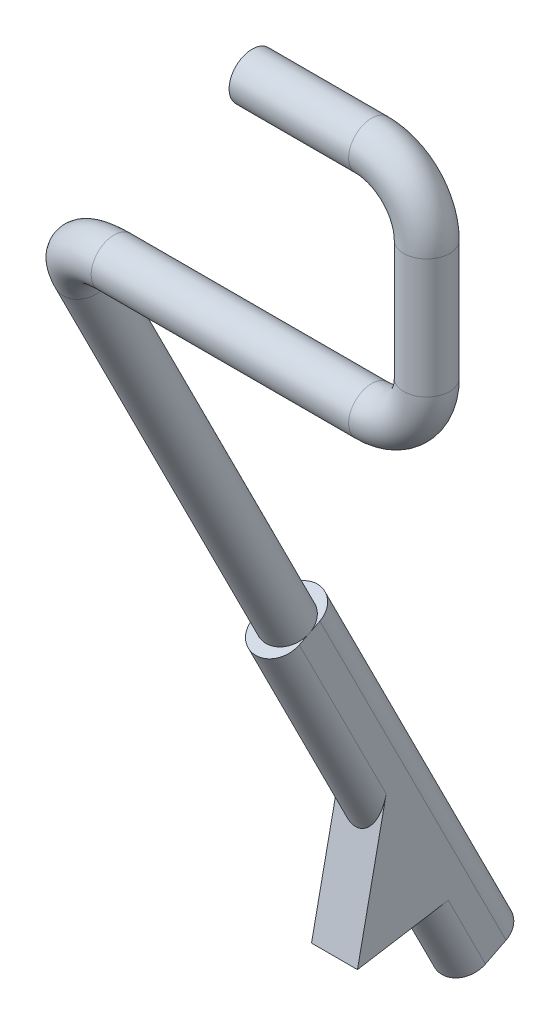
ISO-10303-21;
HEADER;
FILE_DESCRIPTION(('STEP AP214'),'2;1');
FILE_NAME('part.step','',(''),(''),'','','');
FILE_SCHEMA(('AUTOMOTIVE_DESIGN { 1 0 10303 214 1 1 1 1 }'));
ENDSEC;
DATA;
#1=APPLICATION_CONTEXT('core data for automotive mechanical design processes');
#2=APPLICATION_PROTOCOL_DEFINITION('international standard','automotive_design',2000,#1);
#3=PRODUCT_CONTEXT('',#1,'mechanical');
#4=PRODUCT('Part','Part','',(#3));
#5=PRODUCT_RELATED_PRODUCT_CATEGORY('part','',(#4));
#6=PRODUCT_DEFINITION_FORMATION('','',#4);
#7=PRODUCT_DEFINITION_CONTEXT('part definition',#1,'design');
#8=PRODUCT_DEFINITION('design','',#6,#7);
#9=PRODUCT_DEFINITION_SHAPE('','',#8);
#10=(LENGTH_UNIT() NAMED_UNIT(*) SI_UNIT(.MILLI.,.METRE.));
#11=(NAMED_UNIT(*) PLANE_ANGLE_UNIT() SI_UNIT($,.RADIAN.));
#12=(NAMED_UNIT(*) SI_UNIT($,.STERADIAN.) SOLID_ANGLE_UNIT());
#13=UNCERTAINTY_MEASURE_WITH_UNIT(LENGTH_MEASURE(1.E-05),#10,'distance_accuracy_value','');
#14=(GEOMETRIC_REPRESENTATION_CONTEXT(3) GLOBAL_UNCERTAINTY_ASSIGNED_CONTEXT((#13)) GLOBAL_UNIT_ASSIGNED_CONTEXT((#10,
#11,#12)) REPRESENTATION_CONTEXT('',''));
#15=CARTESIAN_POINT('',(0.,0.,0.));
#16=DIRECTION('',(0.,0.,1.));
#17=DIRECTION('',(1.,0.,0.));
#18=AXIS2_PLACEMENT_3D('',#15,#16,#17);
#19=CARTESIAN_POINT('',(-40.,-74.6790705236024,-23.6337143062818));
#20=DIRECTION('',(0.,-0.893028554974588,-0.45));
#21=DIRECTION('',(0.,0.45,-0.893028554974588));
#22=AXIS2_PLACEMENT_3D('',#19,#20,#21);
#23=CYLINDRICAL_SURFACE('',#22,2.5);
#24=CARTESIAN_POINT('',(-40.,-93.4326701780686,-33.0837143062817));
#25=DIRECTION('',(0.,0.203668249795082,0.979039960382317));
#26=DIRECTION('',(0.,-0.979039960382317,0.203668249795082));
#27=AXIS2_PLACEMENT_3D('',#24,#25,#26);
#28=ELLIPSE('',#27,4.01638979441671,2.5);
#29=CARTESIAN_POINT('',(-37.5,-93.4326701780687,-33.0837143062817));
#30=VERTEX_POINT('',#29);
#31=CARTESIAN_POINT('',(-42.5000000000001,-93.4326701780687,-33.0837143062817));
#32=VERTEX_POINT('',#31);
#33=EDGE_CURVE('E11',#30,#32,#28,.F.);
#34=ORIENTED_EDGE('',*,*,#33,.F.);
#35=DIRECTION('',(0.,-0.893028554974588,-0.45));
#36=VECTOR('',#35,1.);
#37=CARTESIAN_POINT('',(-37.5,-74.6790705236024,-23.6337143062818));
#38=LINE('',#37,#36);
#39=CARTESIAN_POINT('',(-37.5,-74.6790705236024,-23.6337143062818));
#40=VERTEX_POINT('',#39);
#41=EDGE_CURVE('E143',#40,#30,#38,.T.);
#42=ORIENTED_EDGE('',*,*,#41,.F.);
#43=CARTESIAN_POINT('',(-40.,-74.6790705236024,-23.6337143062818));
#44=DIRECTION('',(0.,-0.893028554974587,-0.450000000000001));
#45=DIRECTION('',(0.,0.450000000000001,-0.893028554974587));
#46=AXIS2_PLACEMENT_3D('',#43,#44,#45);
#47=CIRCLE('',#46,2.5);
#48=CARTESIAN_POINT('',(-42.5,-74.6790705236024,-23.6337143062818));
#49=VERTEX_POINT('',#48);
#50=EDGE_CURVE('E207',#40,#49,#47,.T.);
#51=ORIENTED_EDGE('',*,*,#50,.T.);
#52=DIRECTION('',(0.,-0.893028554974588,-0.45));
#53=VECTOR('',#52,1.);
#54=CARTESIAN_POINT('',(-42.5,-74.6790705236024,-23.6337143062818));
#55=LINE('',#54,#53);
#56=EDGE_CURVE('E142',#49,#32,#55,.T.);
#57=ORIENTED_EDGE('',*,*,#56,.T.);
#58=EDGE_LOOP('',(#34,#42,#51,#57));
#59=FACE_BOUND('',#58,.T.);
#60=ADVANCED_FACE('F51',(#59),#23,.T.);
#61=CARTESIAN_POINT('',(-40.,-114.302855497459,-45.));
#62=DIRECTION('',(0.,0.893028554974588,0.45));
#63=DIRECTION('',(0.,-0.45,0.893028554974588));
#64=AXIS2_PLACEMENT_3D('',#61,#62,#63);
#65=CYLINDRICAL_SURFACE('',#64,2.5);
#66=CARTESIAN_POINT('',(-40.,-30.3581713298475,-2.70000000000001));
#67=DIRECTION('',(0.,-0.893028554974588,-0.45));
#68=DIRECTION('',(0.450000000000002,0.401862849738564,-0.7975));
#69=AXIS2_PLACEMENT_3D('',#66,#67,#68);
#70=CIRCLE('',#69,2.5);
#71=CARTESIAN_POINT('',(-42.5,-30.3581713298475,-2.70000000000001));
#72=VERTEX_POINT('',#71);
#73=EDGE_CURVE('E155',#72,#72,#70,.T.);
#74=ORIENTED_EDGE('',*,*,#73,.T.);
#75=EDGE_LOOP('',(#74));
#76=FACE_BOUND('',#75,.T.);
#77=CARTESIAN_POINT('',(-40.,-74.1165705236024,-24.75));
#78=DIRECTION('',(0.,-0.893028554974587,-0.450000000000001));
#79=DIRECTION('',(0.,0.450000000000001,-0.893028554974587));
#80=AXIS2_PLACEMENT_3D('',#77,#78,#79);
#81=CIRCLE('',#80,2.5);
#82=CARTESIAN_POINT('',(-37.5,-74.1165705236024,-24.75));
#83=VERTEX_POINT('',#82);
#84=CARTESIAN_POINT('',(-42.5,-74.1165705236024,-24.75));
#85=VERTEX_POINT('',#84);
#86=EDGE_CURVE('E135',#83,#85,#81,.T.);
#87=ORIENTED_EDGE('',*,*,#86,.F.);
#88=EDGE_CURVE('E74',#85,#83,#81,.T.);
#89=ORIENTED_EDGE('',*,*,#88,.F.);
#90=EDGE_LOOP('',(#87,#89));
#91=FACE_BOUND('',#90,.T.);
#92=ADVANCED_FACE('F266',(#76,#91),#65,.T.);
#93=CARTESIAN_POINT('',(-19.,0.,0.));
#94=DIRECTION('',(1.,0.,0.));
#95=DIRECTION('',(0.,0.,-1.));
#96=AXIS2_PLACEMENT_3D('',#93,#94,#95);
#97=PLANE('',#96);
#98=CARTESIAN_POINT('',(-19.,0.,0.));
#99=DIRECTION('',(1.,0.,0.));
#100=DIRECTION('',(0.,0.,-1.));
#101=AXIS2_PLACEMENT_3D('',#98,#99,#100);
#102=CIRCLE('',#101,2.5);
#103=CARTESIAN_POINT('',(-19.,0.,-2.5));
#104=VERTEX_POINT('',#103);
#105=EDGE_CURVE('E180',#104,#104,#102,.T.);
#106=ORIENTED_EDGE('',*,*,#105,.F.);
#107=EDGE_LOOP('',(#106));
#108=FACE_BOUND('',#107,.T.);
#109=ADVANCED_FACE('F272',(#108),#97,.F.);
#110=CARTESIAN_POINT('',(-34.,-30.3581713298475,-2.70000000000001));
#111=DIRECTION('',(0.,0.450000000000002,-0.893028554974587));
#112=DIRECTION('',(0.,0.893028554974587,0.450000000000002));
#113=AXIS2_PLACEMENT_3D('',#110,#111,#112);
#114=TOROIDAL_SURFACE('',#113,6.00000000000001,2.5);
#115=CARTESIAN_POINT('',(-34.,-25.,0.));
#116=DIRECTION('',(-1.,0.,0.));
#117=DIRECTION('',(0.,0.,-1.));
#118=AXIS2_PLACEMENT_3D('',#115,#116,#117);
#119=CIRCLE('',#118,2.5);
#120=CARTESIAN_POINT('',(-34.,-22.7674286125635,1.12500000000001));
#121=VERTEX_POINT('',#120);
#122=EDGE_CURVE('E159',#121,#121,#119,.T.);
#123=CARTESIAN_POINT('',(-34.,-30.3581713298475,-2.70000000000001));
#124=DIRECTION('',(0.,0.450000000000002,-0.893028554974587));
#125=DIRECTION('',(0.,0.893028554974587,0.450000000000002));
#126=AXIS2_PLACEMENT_3D('',#123,#124,#125);
#127=CIRCLE('',#126,8.50000000000001);
#128=EDGE_CURVE('',#72,#121,#127,.T.);
#129=ORIENTED_EDGE('',*,*,#73,.F.);
#130=ORIENTED_EDGE('',*,*,#122,.T.);
#131=ORIENTED_EDGE('',*,*,#128,.T.);
#132=ORIENTED_EDGE('',*,*,#128,.F.);
#133=EDGE_LOOP('',(#129,#131,#130,#132));
#134=FACE_BOUND('',#133,.T.);
#135=ADVANCED_FACE('F299',(#134),#114,.T.);
#136=CARTESIAN_POINT('',(-34.,-25.,0.));
#137=DIRECTION('',(1.,0.,0.));
#138=DIRECTION('',(0.,1.,0.));
#139=AXIS2_PLACEMENT_3D('',#136,#137,#138);
#140=CYLINDRICAL_SURFACE('',#139,2.5);
#141=CARTESIAN_POINT('',(-6.,-25.,0.));
#142=DIRECTION('',(-1.,0.,0.));
#143=DIRECTION('',(0.,0.,-1.));
#144=AXIS2_PLACEMENT_3D('',#141,#142,#143);
#145=CIRCLE('',#144,2.5);
#146=CARTESIAN_POINT('',(-6.,-27.5,0.));
#147=VERTEX_POINT('',#146);
#148=EDGE_CURVE('E164',#147,#147,#145,.T.);
#149=ORIENTED_EDGE('',*,*,#148,.T.);
#150=EDGE_LOOP('',(#149));
#151=FACE_BOUND('',#150,.T.);
#152=ORIENTED_EDGE('',*,*,#122,.F.);
#153=EDGE_LOOP('',(#152));
#154=FACE_BOUND('',#153,.T.);
#155=ADVANCED_FACE('F304',(#151,#154),#140,.T.);
#156=CARTESIAN_POINT('',(-6.,-19.,0.));
#157=DIRECTION('',(0.,0.,1.));
#158=DIRECTION('',(1.,0.,0.));
#159=AXIS2_PLACEMENT_3D('',#156,#157,#158);
#160=TOROIDAL_SURFACE('',#159,6.,2.5);
#161=CARTESIAN_POINT('',(0.,-19.,0.));
#162=DIRECTION('',(0.,-1.,0.));
#163=DIRECTION('',(0.,0.,-1.));
#164=AXIS2_PLACEMENT_3D('',#161,#162,#163);
#165=CIRCLE('',#164,2.5);
#166=CARTESIAN_POINT('',(2.5,-19.,0.));
#167=VERTEX_POINT('',#166);
#168=EDGE_CURVE('E168',#167,#167,#165,.T.);
#169=CARTESIAN_POINT('',(-6.,-19.,0.));
#170=DIRECTION('',(0.,0.,1.));
#171=DIRECTION('',(1.,0.,0.));
#172=AXIS2_PLACEMENT_3D('',#169,#170,#171);
#173=CIRCLE('',#172,8.5);
#174=EDGE_CURVE('',#147,#167,#173,.T.);
#175=ORIENTED_EDGE('',*,*,#148,.F.);
#176=ORIENTED_EDGE('',*,*,#168,.T.);
#177=ORIENTED_EDGE('',*,*,#174,.T.);
#178=ORIENTED_EDGE('',*,*,#174,.F.);
#179=EDGE_LOOP('',(#175,#177,#176,#178));
#180=FACE_BOUND('',#179,.T.);
#181=ADVANCED_FACE('F315',(#180),#160,.T.);
#182=CARTESIAN_POINT('',(0.,-19.,0.));
#183=DIRECTION('',(0.,1.,0.));
#184=DIRECTION('',(-1.,0.,0.));
#185=AXIS2_PLACEMENT_3D('',#182,#183,#184);
#186=CYLINDRICAL_SURFACE('',#185,2.5);
#187=CARTESIAN_POINT('',(0.,-6.00000000000004,0.));
#188=DIRECTION('',(0.,-1.,0.));
#189=DIRECTION('',(0.,0.,-1.));
#190=AXIS2_PLACEMENT_3D('',#187,#188,#189);
#191=CIRCLE('',#190,2.5);
#192=CARTESIAN_POINT('',(2.5,-6.00000000000006,0.));
#193=VERTEX_POINT('',#192);
#194=EDGE_CURVE('E172',#193,#193,#191,.T.);
#195=ORIENTED_EDGE('',*,*,#194,.T.);
#196=EDGE_LOOP('',(#195));
#197=FACE_BOUND('',#196,.T.);
#198=ORIENTED_EDGE('',*,*,#168,.F.);
#199=EDGE_LOOP('',(#198));
#200=FACE_BOUND('',#199,.T.);
#201=ADVANCED_FACE('F311',(#197,#200),#186,.T.);
#202=CARTESIAN_POINT('',(-6.,-6.,0.));
#203=DIRECTION('',(0.,0.,1.));
#204=DIRECTION('',(1.,0.,0.));
#205=AXIS2_PLACEMENT_3D('',#202,#203,#204);
#206=TOROIDAL_SURFACE('',#205,6.,2.5);
#207=CARTESIAN_POINT('',(-6.00000000000004,1.30971622436249E-13,0.));
#208=DIRECTION('',(1.,0.,0.));
#209=DIRECTION('',(0.,0.,-1.));
#210=AXIS2_PLACEMENT_3D('',#207,#208,#209);
#211=CIRCLE('',#210,2.5);
#212=CARTESIAN_POINT('',(-6.00000000000006,2.5,0.));
#213=VERTEX_POINT('',#212);
#214=EDGE_CURVE('E176',#213,#213,#211,.T.);
#215=CARTESIAN_POINT('',(-6.,-6.,0.));
#216=DIRECTION('',(0.,0.,1.));
#217=DIRECTION('',(1.,0.,0.));
#218=AXIS2_PLACEMENT_3D('',#215,#216,#217);
#219=CIRCLE('',#218,8.5);
#220=EDGE_CURVE('',#193,#213,#219,.T.);
#221=ORIENTED_EDGE('',*,*,#194,.F.);
#222=ORIENTED_EDGE('',*,*,#214,.T.);
#223=ORIENTED_EDGE('',*,*,#220,.T.);
#224=ORIENTED_EDGE('',*,*,#220,.F.);
#225=EDGE_LOOP('',(#221,#223,#222,#224));
#226=FACE_BOUND('',#225,.T.);
#227=ADVANCED_FACE('F295',(#226),#206,.T.);
#228=CARTESIAN_POINT('',(-6.00000000000004,0.,0.));
#229=DIRECTION('',(-1.,0.,0.));
#230=DIRECTION('',(0.,-1.,0.));
#231=AXIS2_PLACEMENT_3D('',#228,#229,#230);
#232=CYLINDRICAL_SURFACE('',#231,2.5);
#233=ORIENTED_EDGE('',*,*,#105,.T.);
#234=EDGE_LOOP('',(#233));
#235=FACE_BOUND('',#234,.T.);
#236=ORIENTED_EDGE('',*,*,#214,.F.);
#237=EDGE_LOOP('',(#236));
#238=FACE_BOUND('',#237,.T.);
#239=ADVANCED_FACE('F275',(#235,#238),#232,.T.);
#240=CARTESIAN_POINT('',(-37.5,-69.0540705236023,-34.7965712434642));
#241=DIRECTION('',(-1.,0.,0.));
#242=DIRECTION('',(0.,-1.,0.));
#243=AXIS2_PLACEMENT_3D('',#240,#241,#242);
#244=PLANE('',#243);
#245=DIRECTION('',(0.,0.450000000000001,-0.893028554974587));
#246=VECTOR('',#245,1.);
#247=CARTESIAN_POINT('',(-37.5,-109.240355497459,-55.0465712434642));
#248=LINE('',#247,#246);
#249=CARTESIAN_POINT('',(-37.5,-114.865355497459,-43.8837143062818));
#250=VERTEX_POINT('',#249);
#251=CARTESIAN_POINT('',(-37.5,-113.740355497459,-46.1162856937183));
#252=VERTEX_POINT('',#251);
#253=EDGE_CURVE('E216',#250,#252,#248,.T.);
#254=ORIENTED_EDGE('',*,*,#253,.T.);
#255=DIRECTION('',(0.,-0.893028554974588,-0.45));
#256=VECTOR('',#255,1.);
#257=CARTESIAN_POINT('',(-37.5,-73.5540705236024,-25.8662856937183));
#258=LINE('',#257,#256);
#259=CARTESIAN_POINT('',(-37.5,-73.5540705236024,-25.8662856937183));
#260=VERTEX_POINT('',#259);
#261=EDGE_CURVE('E160',#260,#252,#258,.T.);
#262=ORIENTED_EDGE('',*,*,#261,.F.);
#263=DIRECTION('',(0.,0.450000000000001,-0.893028554974587));
#264=VECTOR('',#263,1.);
#265=CARTESIAN_POINT('',(-37.5,-69.0540705236023,-34.7965712434642));
#266=LINE('',#265,#264);
#267=EDGE_CURVE('E227',#83,#260,#266,.T.);
#268=ORIENTED_EDGE('',*,*,#267,.F.);
#269=EDGE_CURVE('E199',#40,#83,#266,.T.);
#270=ORIENTED_EDGE('',*,*,#269,.F.);
#271=ORIENTED_EDGE('',*,*,#41,.T.);
#272=DIRECTION('',(0.,-0.979039960382317,0.203668249795082));
#273=VECTOR('',#272,1.);
#274=CARTESIAN_POINT('',(-37.5,-108.432670178069,-29.9632862639644));
#275=LINE('',#274,#273);
#276=CARTESIAN_POINT('',(-37.5,-108.432670178069,-29.9632862639644));
#277=VERTEX_POINT('',#276);
#278=EDGE_CURVE('E250',#30,#277,#275,.T.);
#279=ORIENTED_EDGE('',*,*,#278,.T.);
#280=DIRECTION('',(0.,0.160457167538118,-0.987042804231734));
#281=VECTOR('',#280,1.);
#282=CARTESIAN_POINT('',(-37.5,-106.828098502688,-39.8337143062817));
#283=LINE('',#282,#281);
#284=CARTESIAN_POINT('',(-37.5,-106.828098502687,-39.8337143062818));
#285=VERTEX_POINT('',#284);
#286=EDGE_CURVE('E67',#277,#285,#283,.T.);
#287=ORIENTED_EDGE('',*,*,#286,.T.);
#288=EDGE_CURVE('E133',#285,#250,#38,.T.);
#289=ORIENTED_EDGE('',*,*,#288,.T.);
#290=EDGE_LOOP('',(#254,#262,#268,#270,#271,#279,#287,#289));
#291=FACE_BOUND('',#290,.T.);
#292=ADVANCED_FACE('F239',(#291),#244,.F.);
#293=CARTESIAN_POINT('',(-42.5,-69.0540705236024,-34.7965712434641));
#294=DIRECTION('',(-1.,0.,0.));
#295=DIRECTION('',(0.,0.,1.));
#296=AXIS2_PLACEMENT_3D('',#293,#294,#295);
#297=PLANE('',#296);
#298=DIRECTION('',(0.,0.450000000000001,-0.893028554974587));
#299=VECTOR('',#298,1.);
#300=CARTESIAN_POINT('',(-42.5,-69.0540705236024,-34.7965712434641));
#301=LINE('',#300,#299);
#302=EDGE_CURVE('E196',#49,#85,#301,.T.);
#303=ORIENTED_EDGE('',*,*,#302,.T.);
#304=CARTESIAN_POINT('',(-42.5,-73.5540705236024,-25.8662856937183));
#305=VERTEX_POINT('',#304);
#306=EDGE_CURVE('E201',#85,#305,#301,.T.);
#307=ORIENTED_EDGE('',*,*,#306,.T.);
#308=DIRECTION('',(0.,-0.893028554974588,-0.45));
#309=VECTOR('',#308,1.);
#310=CARTESIAN_POINT('',(-42.5,-73.5540705236024,-25.8662856937183));
#311=LINE('',#310,#309);
#312=CARTESIAN_POINT('',(-42.5,-113.740355497459,-46.1162856937183));
#313=VERTEX_POINT('',#312);
#314=EDGE_CURVE('E149',#305,#313,#311,.T.);
#315=ORIENTED_EDGE('',*,*,#314,.T.);
#316=DIRECTION('',(0.,0.450000000000001,-0.893028554974587));
#317=VECTOR('',#316,1.);
#318=CARTESIAN_POINT('',(-42.5,-109.240355497459,-55.0465712434641));
#319=LINE('',#318,#317);
#320=CARTESIAN_POINT('',(-42.5,-114.865355497459,-43.8837143062818));
#321=VERTEX_POINT('',#320);
#322=EDGE_CURVE('E139',#321,#313,#319,.T.);
#323=ORIENTED_EDGE('',*,*,#322,.F.);
#324=CARTESIAN_POINT('',(-42.5000000000001,-106.828098502687,-39.8337143062817));
#325=VERTEX_POINT('',#324);
#326=EDGE_CURVE('E131',#325,#321,#55,.T.);
#327=ORIENTED_EDGE('',*,*,#326,.F.);
#328=DIRECTION('',(0.,-0.160457167538118,0.987042804231734));
#329=VECTOR('',#328,1.);
#330=CARTESIAN_POINT('',(-42.5000000000001,-106.828098502687,-39.8337143062817));
#331=LINE('',#330,#329);
#332=CARTESIAN_POINT('',(-42.5000000000001,-108.432670178069,-29.9632862639644));
#333=VERTEX_POINT('',#332);
#334=EDGE_CURVE('E115',#325,#333,#331,.T.);
#335=ORIENTED_EDGE('',*,*,#334,.T.);
#336=DIRECTION('',(0.,0.979039960382317,-0.203668249795082));
#337=VECTOR('',#336,1.);
#338=CARTESIAN_POINT('',(-42.5000000000001,-108.432670178069,-29.9632862639644));
#339=LINE('',#338,#337);
#340=EDGE_CURVE('E126',#333,#32,#339,.T.);
#341=ORIENTED_EDGE('',*,*,#340,.T.);
#342=ORIENTED_EDGE('',*,*,#56,.F.);
#343=EDGE_LOOP('',(#303,#307,#315,#323,#327,#335,#341,#342));
#344=FACE_BOUND('',#343,.T.);
#345=ADVANCED_FACE('F137',(#344),#297,.T.);
#346=CARTESIAN_POINT('',(0.,-69.0540705236024,-34.7965712434642));
#347=DIRECTION('',(0.,-0.893028554974587,-0.450000000000001));
#348=DIRECTION('',(0.,0.450000000000001,-0.893028554974587));
#349=AXIS2_PLACEMENT_3D('',#346,#347,#348);
#350=PLANE('',#349);
#351=ORIENTED_EDGE('',*,*,#269,.T.);
#352=ORIENTED_EDGE('',*,*,#86,.T.);
#353=ORIENTED_EDGE('',*,*,#302,.F.);
#354=ORIENTED_EDGE('',*,*,#50,.F.);
#355=EDGE_LOOP('',(#351,#352,#353,#354));
#356=FACE_BOUND('',#355,.T.);
#357=ADVANCED_FACE('F194',(#356),#350,.F.);
#358=CARTESIAN_POINT('',(-40.,-73.5540705236024,-25.8662856937183));
#359=DIRECTION('',(0.,-0.893028554974588,-0.45));
#360=DIRECTION('',(0.,0.45,-0.893028554974588));
#361=AXIS2_PLACEMENT_3D('',#358,#359,#360);
#362=CYLINDRICAL_SURFACE('',#361,2.50000000000001);
#363=CARTESIAN_POINT('',(-40.,-113.740355497459,-46.1162856937183));
#364=DIRECTION('',(0.,-0.893028554974587,-0.450000000000001));
#365=DIRECTION('',(0.,0.450000000000001,-0.893028554974587));
#366=AXIS2_PLACEMENT_3D('',#363,#364,#365);
#367=CIRCLE('',#366,2.50000000000001);
#368=EDGE_CURVE('E224',#313,#252,#367,.T.);
#369=ORIENTED_EDGE('',*,*,#368,.F.);
#370=ORIENTED_EDGE('',*,*,#314,.F.);
#371=CARTESIAN_POINT('',(-40.,-73.5540705236024,-25.8662856937183));
#372=DIRECTION('',(0.,-0.893028554974587,-0.450000000000001));
#373=DIRECTION('',(0.,0.450000000000001,-0.893028554974587));
#374=AXIS2_PLACEMENT_3D('',#371,#372,#373);
#375=CIRCLE('',#374,2.50000000000001);
#376=EDGE_CURVE('E204',#305,#260,#375,.T.);
#377=ORIENTED_EDGE('',*,*,#376,.T.);
#378=ORIENTED_EDGE('',*,*,#261,.T.);
#379=EDGE_LOOP('',(#369,#370,#377,#378));
#380=FACE_BOUND('',#379,.T.);
#381=ADVANCED_FACE('F236',(#380),#362,.T.);
#382=CARTESIAN_POINT('',(-40.,-106.828098502687,-39.8337143062818));
#383=DIRECTION('',(0.,-0.987042804231734,-0.160457167538118));
#384=DIRECTION('',(0.,0.160457167538118,-0.987042804231734));
#385=AXIS2_PLACEMENT_3D('',#382,#383,#384);
#386=ELLIPSE('',#385,2.62147073680379,2.5);
#387=EDGE_CURVE('E60',#325,#285,#386,.F.);
#388=ORIENTED_EDGE('',*,*,#387,.F.);
#389=ORIENTED_EDGE('',*,*,#326,.T.);
#390=CARTESIAN_POINT('',(-40.,-114.865355497459,-43.8837143062818));
#391=DIRECTION('',(0.,-0.893028554974587,-0.450000000000001));
#392=DIRECTION('',(0.,0.450000000000001,-0.893028554974587));
#393=AXIS2_PLACEMENT_3D('',#390,#391,#392);
#394=CIRCLE('',#393,2.5);
#395=EDGE_CURVE('E219',#250,#321,#394,.T.);
#396=ORIENTED_EDGE('',*,*,#395,.F.);
#397=ORIENTED_EDGE('',*,*,#288,.F.);
#398=EDGE_LOOP('',(#388,#389,#396,#397));
#399=FACE_BOUND('',#398,.T.);
#400=ADVANCED_FACE('F129',(#399),#23,.T.);
#401=ORIENTED_EDGE('',*,*,#306,.F.);
#402=ORIENTED_EDGE('',*,*,#88,.T.);
#403=ORIENTED_EDGE('',*,*,#267,.T.);
#404=ORIENTED_EDGE('',*,*,#376,.F.);
#405=EDGE_LOOP('',(#401,#402,#403,#404));
#406=FACE_BOUND('',#405,.T.);
#407=ADVANCED_FACE('F202',(#406),#350,.F.);
#408=CARTESIAN_POINT('',(-40.,-114.302855497459,-45.));
#409=DIRECTION('',(0.,-0.893028554974588,-0.45));
#410=DIRECTION('',(0.450000000000002,0.401862849738564,-0.7975));
#411=AXIS2_PLACEMENT_3D('',#408,#409,#410);
#412=PLANE('',#411);
#413=ORIENTED_EDGE('',*,*,#368,.T.);
#414=ORIENTED_EDGE('',*,*,#253,.F.);
#415=ORIENTED_EDGE('',*,*,#395,.T.);
#416=ORIENTED_EDGE('',*,*,#322,.T.);
#417=EDGE_LOOP('',(#413,#414,#415,#416));
#418=FACE_BOUND('',#417,.T.);
#419=ADVANCED_FACE('F53',(#418),#412,.T.);
#420=CARTESIAN_POINT('',(-19.5437935593688,-108.432670178069,-29.9632862639644));
#421=DIRECTION('',(0.,0.203668249795082,0.979039960382317));
#422=DIRECTION('',(0.,-0.979039960382317,0.203668249795082));
#423=AXIS2_PLACEMENT_3D('',#420,#421,#422);
#424=PLANE('',#423);
#425=ORIENTED_EDGE('',*,*,#278,.F.);
#426=ORIENTED_EDGE('',*,*,#33,.T.);
#427=ORIENTED_EDGE('',*,*,#340,.F.);
#428=DIRECTION('',(-1.,0.,0.));
#429=VECTOR('',#428,1.);
#430=CARTESIAN_POINT('',(-19.5437935593688,-108.432670178069,-29.9632862639644));
#431=LINE('',#430,#429);
#432=EDGE_CURVE('E120',#277,#333,#431,.T.);
#433=ORIENTED_EDGE('',*,*,#432,.F.);
#434=EDGE_LOOP('',(#425,#426,#427,#433));
#435=FACE_BOUND('',#434,.T.);
#436=ADVANCED_FACE('F259',(#435),#424,.T.);
#437=CARTESIAN_POINT('',(-19.5437935593688,-106.828098502688,-39.8337143062817));
#438=DIRECTION('',(0.,-0.987042804231734,-0.160457167538118));
#439=DIRECTION('',(0.,0.160457167538118,-0.987042804231734));
#440=AXIS2_PLACEMENT_3D('',#437,#438,#439);
#441=PLANE('',#440);
#442=ORIENTED_EDGE('',*,*,#334,.F.);
#443=ORIENTED_EDGE('',*,*,#387,.T.);
#444=ORIENTED_EDGE('',*,*,#286,.F.);
#445=ORIENTED_EDGE('',*,*,#432,.T.);
#446=EDGE_LOOP('',(#442,#443,#444,#445));
#447=FACE_BOUND('',#446,.T.);
#448=ADVANCED_FACE('F117',(#447),#441,.T.);
#449=CLOSED_SHELL('',(#60,#92,#109,#135,#155,#181,#201,#227,#239,#292,#345,#357,#381,#400,#407,
#419,#436,#448));
#450=MANIFOLD_SOLID_BREP('B2',#449);
#451=ADVANCED_BREP_SHAPE_REPRESENTATION('',(#18,#450),#14);
#452=SHAPE_DEFINITION_REPRESENTATION(#9,#451);
ENDSEC;
END-ISO-10303-21;
